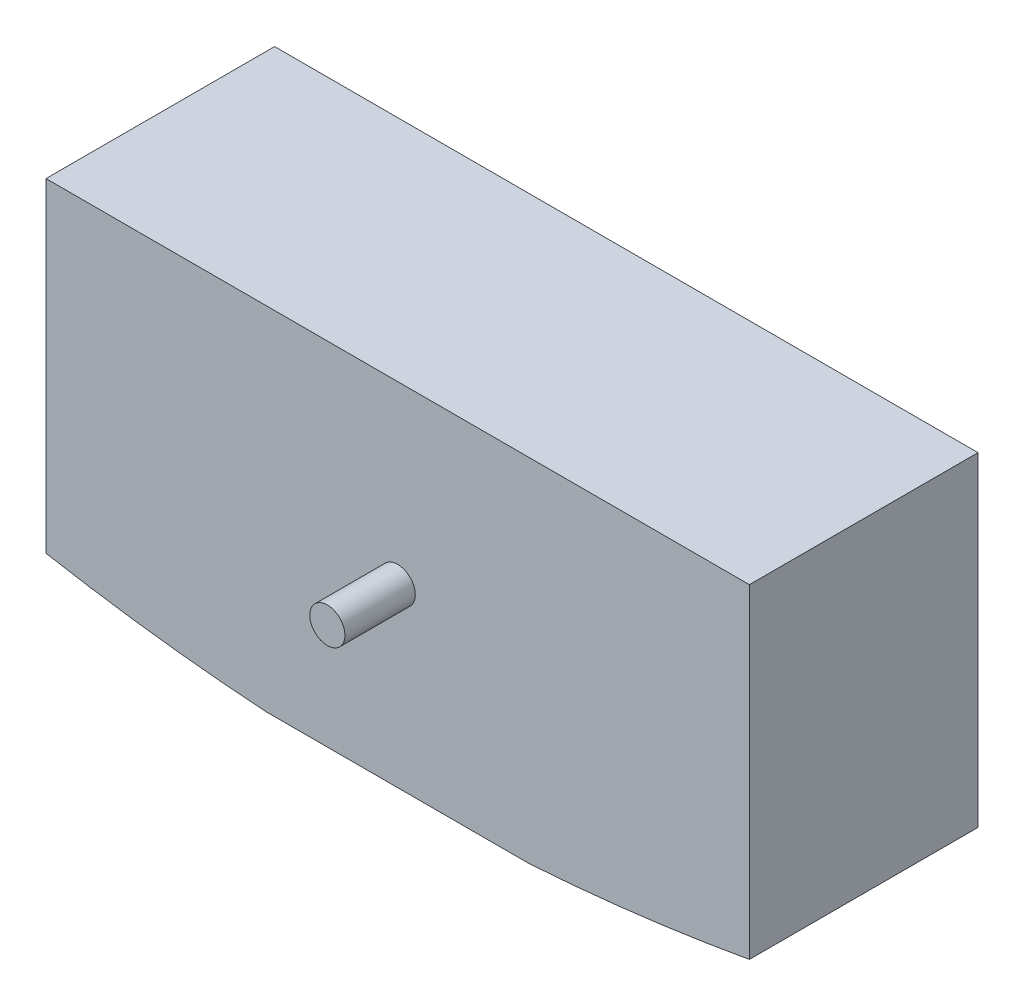
ISO-10303-21;
HEADER;
FILE_DESCRIPTION(('STEP AP214'),'2;1');
FILE_NAME('part.step','',(''),(''),'','','');
FILE_SCHEMA(('AUTOMOTIVE_DESIGN { 1 0 10303 214 1 1 1 1 }'));
ENDSEC;
DATA;
#1=APPLICATION_CONTEXT('core data for automotive mechanical design processes');
#2=APPLICATION_PROTOCOL_DEFINITION('international standard','automotive_design',2000,#1);
#3=PRODUCT_CONTEXT('',#1,'mechanical');
#4=PRODUCT('Part','Part','',(#3));
#5=PRODUCT_RELATED_PRODUCT_CATEGORY('part','',(#4));
#6=PRODUCT_DEFINITION_FORMATION('','',#4);
#7=PRODUCT_DEFINITION_CONTEXT('part definition',#1,'design');
#8=PRODUCT_DEFINITION('design','',#6,#7);
#9=PRODUCT_DEFINITION_SHAPE('','',#8);
#10=(LENGTH_UNIT() NAMED_UNIT(*) SI_UNIT(.MILLI.,.METRE.));
#11=(NAMED_UNIT(*) PLANE_ANGLE_UNIT() SI_UNIT($,.RADIAN.));
#12=(NAMED_UNIT(*) SI_UNIT($,.STERADIAN.) SOLID_ANGLE_UNIT());
#13=UNCERTAINTY_MEASURE_WITH_UNIT(LENGTH_MEASURE(1.E-05),#10,'distance_accuracy_value','');
#14=(GEOMETRIC_REPRESENTATION_CONTEXT(3) GLOBAL_UNCERTAINTY_ASSIGNED_CONTEXT((#13)) GLOBAL_UNIT_ASSIGNED_CONTEXT((#10,
#11,#12)) REPRESENTATION_CONTEXT('',''));
#15=CARTESIAN_POINT('',(0.,0.,0.));
#16=DIRECTION('',(0.,0.,1.));
#17=DIRECTION('',(1.,0.,0.));
#18=AXIS2_PLACEMENT_3D('',#15,#16,#17);
#19=CARTESIAN_POINT('',(100.,-50.,65.));
#20=DIRECTION('',(1.,0.,0.));
#21=DIRECTION('',(0.,0.,-1.));
#22=AXIS2_PLACEMENT_3D('',#19,#20,#21);
#23=PLANE('',#22);
#24=DIRECTION('',(0.,-1.,0.));
#25=VECTOR('',#24,1.);
#26=CARTESIAN_POINT('',(100.,-50.,0.));
#27=LINE('',#26,#25);
#28=CARTESIAN_POINT('',(100.,50.,0.));
#29=VERTEX_POINT('',#28);
#30=CARTESIAN_POINT('',(100.,-42.2858578233202,0.));
#31=VERTEX_POINT('',#30);
#32=EDGE_CURVE('E46',#29,#31,#27,.T.);
#33=ORIENTED_EDGE('',*,*,#32,.F.);
#34=DIRECTION('',(0.,0.,-1.));
#35=VECTOR('',#34,1.);
#36=CARTESIAN_POINT('',(100.,50.,65.));
#37=LINE('',#36,#35);
#38=CARTESIAN_POINT('',(100.,50.,65.));
#39=VERTEX_POINT('',#38);
#40=EDGE_CURVE('E102',#39,#29,#37,.T.);
#41=ORIENTED_EDGE('',*,*,#40,.F.);
#42=DIRECTION('',(0.,1.,0.));
#43=VECTOR('',#42,1.);
#44=CARTESIAN_POINT('',(100.,-50.,65.));
#45=LINE('',#44,#43);
#46=CARTESIAN_POINT('',(100.,-42.2858578233202,65.));
#47=VERTEX_POINT('',#46);
#48=EDGE_CURVE('E119',#47,#39,#45,.T.);
#49=ORIENTED_EDGE('',*,*,#48,.F.);
#50=DIRECTION('',(0.,0.,-1.));
#51=VECTOR('',#50,1.);
#52=CARTESIAN_POINT('',(100.,-42.2858578233202,77.));
#53=LINE('',#52,#51);
#54=EDGE_CURVE('E133',#47,#31,#53,.T.);
#55=ORIENTED_EDGE('',*,*,#54,.T.);
#56=EDGE_LOOP('',(#33,#41,#49,#55));
#57=FACE_BOUND('',#56,.T.);
#58=ADVANCED_FACE('F33',(#57),#23,.T.);
#59=CARTESIAN_POINT('',(-100.,-50.,65.));
#60=DIRECTION('',(0.,0.,1.));
#61=DIRECTION('',(1.,0.,0.));
#62=AXIS2_PLACEMENT_3D('',#59,#60,#61);
#63=PLANE('',#62);
#64=CARTESIAN_POINT('',(0.,0.,65.));
#65=DIRECTION('',(0.,0.,1.));
#66=DIRECTION('',(1.,0.,0.));
#67=AXIS2_PLACEMENT_3D('',#64,#65,#66);
#68=CIRCLE('',#67,5.);
#69=CARTESIAN_POINT('',(5.,0.,65.));
#70=VERTEX_POINT('',#69);
#71=EDGE_CURVE('E135',#70,#70,#68,.T.);
#72=ORIENTED_EDGE('',*,*,#71,.F.);
#73=EDGE_LOOP('',(#72));
#74=FACE_BOUND('',#73,.T.);
#75=DIRECTION('',(1.,0.,0.));
#76=VECTOR('',#75,1.);
#77=CARTESIAN_POINT('',(-100.,-50.,65.));
#78=LINE('',#77,#76);
#79=CARTESIAN_POINT('',(-37.5192884555948,-50.,65.));
#80=VERTEX_POINT('',#79);
#81=CARTESIAN_POINT('',(37.5192884555947,-50.,65.));
#82=VERTEX_POINT('',#81);
#83=EDGE_CURVE('E111',#80,#82,#78,.T.);
#84=ORIENTED_EDGE('',*,*,#83,.T.);
#85=CARTESIAN_POINT('',(0.,510.775960900919,65.));
#86=DIRECTION('',(0.,0.,1.));
#87=DIRECTION('',(1.,0.,0.));
#88=AXIS2_PLACEMENT_3D('',#85,#86,#87);
#89=CIRCLE('',#88,562.029692570209);
#90=EDGE_CURVE('E132',#82,#47,#89,.T.);
#91=ORIENTED_EDGE('',*,*,#90,.T.);
#92=ORIENTED_EDGE('',*,*,#48,.T.);
#93=DIRECTION('',(1.,0.,0.));
#94=VECTOR('',#93,1.);
#95=CARTESIAN_POINT('',(-100.,50.,65.));
#96=LINE('',#95,#94);
#97=CARTESIAN_POINT('',(-100.,50.,65.));
#98=VERTEX_POINT('',#97);
#99=EDGE_CURVE('E109',#98,#39,#96,.T.);
#100=ORIENTED_EDGE('',*,*,#99,.F.);
#101=DIRECTION('',(0.,1.,0.));
#102=VECTOR('',#101,1.);
#103=CARTESIAN_POINT('',(-100.,-50.,65.));
#104=LINE('',#103,#102);
#105=CARTESIAN_POINT('',(-100.,-42.2858578233202,65.));
#106=VERTEX_POINT('',#105);
#107=EDGE_CURVE('E107',#106,#98,#104,.T.);
#108=ORIENTED_EDGE('',*,*,#107,.F.);
#109=CARTESIAN_POINT('',(0.,510.775960900919,65.));
#110=DIRECTION('',(0.,0.,1.));
#111=DIRECTION('',(1.,0.,0.));
#112=AXIS2_PLACEMENT_3D('',#109,#110,#111);
#113=CIRCLE('',#112,562.029692570209);
#114=EDGE_CURVE('E128',#106,#80,#113,.T.);
#115=ORIENTED_EDGE('',*,*,#114,.T.);
#116=EDGE_LOOP('',(#84,#91,#92,#100,#108,#115));
#117=FACE_BOUND('',#116,.T.);
#118=ADVANCED_FACE('F130',(#74,#117),#63,.T.);
#119=CARTESIAN_POINT('',(-100.,-50.,65.));
#120=DIRECTION('',(-1.,0.,0.));
#121=DIRECTION('',(0.,0.,1.));
#122=AXIS2_PLACEMENT_3D('',#119,#120,#121);
#123=PLANE('',#122);
#124=DIRECTION('',(0.,1.,0.));
#125=VECTOR('',#124,1.);
#126=CARTESIAN_POINT('',(-100.,-50.,0.));
#127=LINE('',#126,#125);
#128=CARTESIAN_POINT('',(-100.,-42.2858578233202,0.));
#129=VERTEX_POINT('',#128);
#130=CARTESIAN_POINT('',(-100.,50.,0.));
#131=VERTEX_POINT('',#130);
#132=EDGE_CURVE('E83',#129,#131,#127,.T.);
#133=ORIENTED_EDGE('',*,*,#132,.F.);
#134=DIRECTION('',(0.,0.,-1.));
#135=VECTOR('',#134,1.);
#136=CARTESIAN_POINT('',(-100.,-42.2858578233202,77.));
#137=LINE('',#136,#135);
#138=EDGE_CURVE('E93',#106,#129,#137,.T.);
#139=ORIENTED_EDGE('',*,*,#138,.F.);
#140=ORIENTED_EDGE('',*,*,#107,.T.);
#141=DIRECTION('',(0.,0.,1.));
#142=VECTOR('',#141,1.);
#143=CARTESIAN_POINT('',(-100.,50.,65.));
#144=LINE('',#143,#142);
#145=EDGE_CURVE('E99',#131,#98,#144,.T.);
#146=ORIENTED_EDGE('',*,*,#145,.F.);
#147=EDGE_LOOP('',(#133,#139,#140,#146));
#148=FACE_BOUND('',#147,.T.);
#149=ADVANCED_FACE('F105',(#148),#123,.T.);
#150=CARTESIAN_POINT('',(0.,-50.,0.));
#151=DIRECTION('',(0.,-1.,0.));
#152=DIRECTION('',(0.,0.,-1.));
#153=AXIS2_PLACEMENT_3D('',#150,#151,#152);
#154=PLANE('',#153);
#155=DIRECTION('',(-1.,0.,0.));
#156=VECTOR('',#155,1.);
#157=CARTESIAN_POINT('',(0.,-50.,0.));
#158=LINE('',#157,#156);
#159=CARTESIAN_POINT('',(37.5192884555947,-50.,0.));
#160=VERTEX_POINT('',#159);
#161=CARTESIAN_POINT('',(-37.5192884555948,-50.,0.));
#162=VERTEX_POINT('',#161);
#163=EDGE_CURVE('E103',#160,#162,#158,.T.);
#164=ORIENTED_EDGE('',*,*,#163,.F.);
#165=DIRECTION('',(0.,0.,-1.));
#166=VECTOR('',#165,1.);
#167=CARTESIAN_POINT('',(37.5192884555948,-50.,77.));
#168=LINE('',#167,#166);
#169=EDGE_CURVE('E40',#160,#82,#168,.F.);
#170=ORIENTED_EDGE('',*,*,#169,.T.);
#171=ORIENTED_EDGE('',*,*,#83,.F.);
#172=DIRECTION('',(0.,0.,-1.));
#173=VECTOR('',#172,1.);
#174=CARTESIAN_POINT('',(-37.5192884555948,-50.,77.));
#175=LINE('',#174,#173);
#176=EDGE_CURVE('E121',#80,#162,#175,.T.);
#177=ORIENTED_EDGE('',*,*,#176,.T.);
#178=EDGE_LOOP('',(#164,#170,#171,#177));
#179=FACE_BOUND('',#178,.T.);
#180=ADVANCED_FACE('F124',(#179),#154,.T.);
#181=CARTESIAN_POINT('',(0.,50.,0.));
#182=DIRECTION('',(0.,-1.,0.));
#183=DIRECTION('',(0.,0.,-1.));
#184=AXIS2_PLACEMENT_3D('',#181,#182,#183);
#185=PLANE('',#184);
#186=ORIENTED_EDGE('',*,*,#40,.T.);
#187=DIRECTION('',(1.,0.,0.));
#188=VECTOR('',#187,1.);
#189=CARTESIAN_POINT('',(-140.761294166455,50.,0.));
#190=LINE('',#189,#188);
#191=EDGE_CURVE('E86',#131,#29,#190,.T.);
#192=ORIENTED_EDGE('',*,*,#191,.F.);
#193=ORIENTED_EDGE('',*,*,#145,.T.);
#194=ORIENTED_EDGE('',*,*,#99,.T.);
#195=EDGE_LOOP('',(#186,#192,#193,#194));
#196=FACE_BOUND('',#195,.T.);
#197=ADVANCED_FACE('F97',(#196),#185,.F.);
#198=CARTESIAN_POINT('',(0.,0.,85.));
#199=DIRECTION('',(0.,0.,-1.));
#200=DIRECTION('',(-1.,0.,0.));
#201=AXIS2_PLACEMENT_3D('',#198,#199,#200);
#202=CYLINDRICAL_SURFACE('',#201,5.);
#203=CARTESIAN_POINT('',(0.,0.,85.));
#204=DIRECTION('',(0.,0.,1.));
#205=DIRECTION('',(1.,0.,0.));
#206=AXIS2_PLACEMENT_3D('',#203,#204,#205);
#207=CIRCLE('',#206,5.);
#208=CARTESIAN_POINT('',(5.,0.,85.));
#209=VERTEX_POINT('',#208);
#210=EDGE_CURVE('E113',#209,#209,#207,.T.);
#211=ORIENTED_EDGE('',*,*,#210,.F.);
#212=EDGE_LOOP('',(#211));
#213=FACE_BOUND('',#212,.T.);
#214=ORIENTED_EDGE('',*,*,#71,.T.);
#215=EDGE_LOOP('',(#214));
#216=FACE_BOUND('',#215,.T.);
#217=ADVANCED_FACE('F145',(#213,#216),#202,.T.);
#218=CARTESIAN_POINT('',(0.,0.,85.));
#219=DIRECTION('',(0.,0.,1.));
#220=DIRECTION('',(1.,0.,0.));
#221=AXIS2_PLACEMENT_3D('',#218,#219,#220);
#222=PLANE('',#221);
#223=ORIENTED_EDGE('',*,*,#210,.T.);
#224=EDGE_LOOP('',(#223));
#225=FACE_BOUND('',#224,.T.);
#226=ADVANCED_FACE('F162',(#225),#222,.T.);
#227=CARTESIAN_POINT('',(0.,510.775960900919,77.));
#228=DIRECTION('',(0.,0.,-1.));
#229=DIRECTION('',(-1.,0.,0.));
#230=AXIS2_PLACEMENT_3D('',#227,#228,#229);
#231=CYLINDRICAL_SURFACE('',#230,562.029692570209);
#232=CARTESIAN_POINT('',(0.,510.775960900919,0.));
#233=DIRECTION('',(0.,0.,1.));
#234=DIRECTION('',(1.,0.,0.));
#235=AXIS2_PLACEMENT_3D('',#232,#233,#234);
#236=CIRCLE('',#235,562.029692570209);
#237=EDGE_CURVE('E88',#162,#129,#236,.F.);
#238=ORIENTED_EDGE('',*,*,#237,.F.);
#239=ORIENTED_EDGE('',*,*,#176,.F.);
#240=ORIENTED_EDGE('',*,*,#114,.F.);
#241=ORIENTED_EDGE('',*,*,#138,.T.);
#242=EDGE_LOOP('',(#238,#239,#240,#241));
#243=FACE_BOUND('',#242,.T.);
#244=ADVANCED_FACE('F127',(#243),#231,.T.);
#245=CARTESIAN_POINT('',(0.,510.775960900919,77.));
#246=DIRECTION('',(0.,0.,-1.));
#247=DIRECTION('',(-1.,0.,0.));
#248=AXIS2_PLACEMENT_3D('',#245,#246,#247);
#249=CYLINDRICAL_SURFACE('',#248,562.029692570209);
#250=CARTESIAN_POINT('',(0.,510.775960900919,0.));
#251=DIRECTION('',(0.,0.,1.));
#252=DIRECTION('',(1.,0.,0.));
#253=AXIS2_PLACEMENT_3D('',#250,#251,#252);
#254=CIRCLE('',#253,562.029692570209);
#255=EDGE_CURVE('E11',#31,#160,#254,.F.);
#256=ORIENTED_EDGE('',*,*,#255,.F.);
#257=ORIENTED_EDGE('',*,*,#54,.F.);
#258=ORIENTED_EDGE('',*,*,#90,.F.);
#259=ORIENTED_EDGE('',*,*,#169,.F.);
#260=EDGE_LOOP('',(#256,#257,#258,#259));
#261=FACE_BOUND('',#260,.T.);
#262=ADVANCED_FACE('F169',(#261),#249,.T.);
#263=CARTESIAN_POINT('',(-140.761294166455,-92.,0.));
#264=DIRECTION('',(0.,0.,1.));
#265=DIRECTION('',(1.,0.,0.));
#266=AXIS2_PLACEMENT_3D('',#263,#264,#265);
#267=PLANE('',#266);
#268=ORIENTED_EDGE('',*,*,#132,.T.);
#269=ORIENTED_EDGE('',*,*,#191,.T.);
#270=ORIENTED_EDGE('',*,*,#32,.T.);
#271=ORIENTED_EDGE('',*,*,#255,.T.);
#272=ORIENTED_EDGE('',*,*,#163,.T.);
#273=ORIENTED_EDGE('',*,*,#237,.T.);
#274=EDGE_LOOP('',(#268,#269,#270,#271,#272,#273));
#275=FACE_BOUND('',#274,.T.);
#276=ADVANCED_FACE('F85',(#275),#267,.F.);
#277=CLOSED_SHELL('',(#58,#118,#149,#180,#197,#217,#226,#244,#262,#276));
#278=MANIFOLD_SOLID_BREP('B2',#277);
#279=ADVANCED_BREP_SHAPE_REPRESENTATION('',(#18,#278),#14);
#280=SHAPE_DEFINITION_REPRESENTATION(#9,#279);
ENDSEC;
END-ISO-10303-21;
